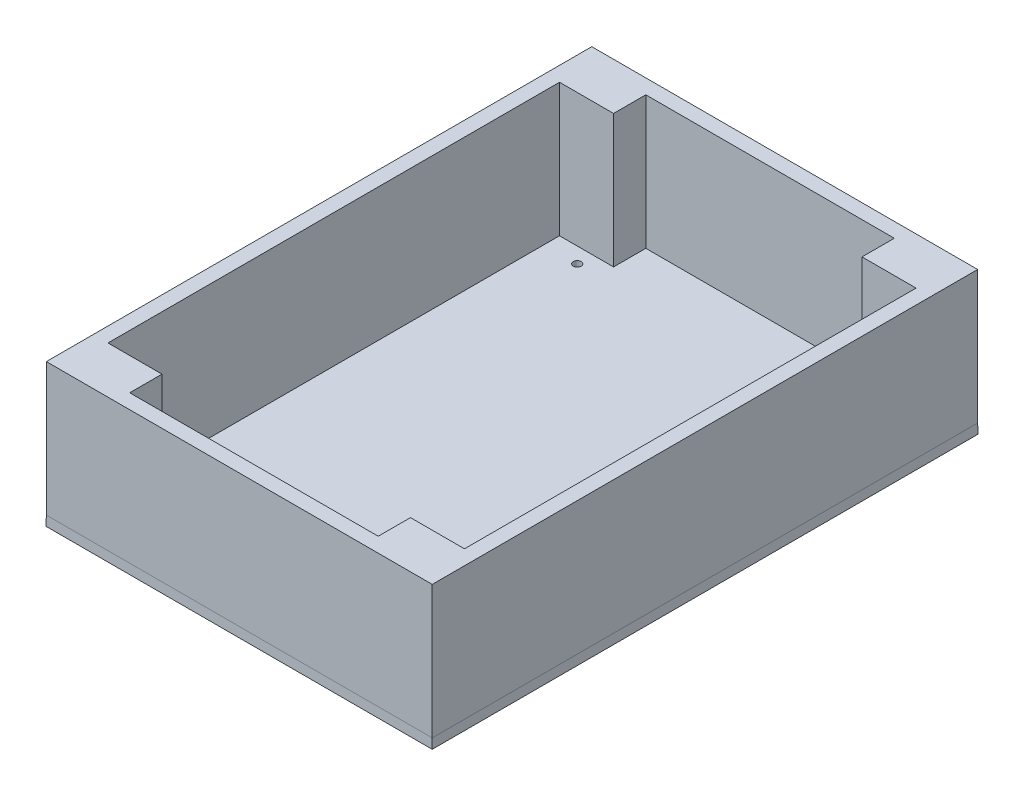
ISO-10303-21;
HEADER;
FILE_DESCRIPTION(('STEP AP214'),'2;1');
FILE_NAME('part.step','',(''),(''),'','','');
FILE_SCHEMA(('AUTOMOTIVE_DESIGN { 1 0 10303 214 1 1 1 1 }'));
ENDSEC;
DATA;
#1=APPLICATION_CONTEXT('core data for automotive mechanical design processes');
#2=APPLICATION_PROTOCOL_DEFINITION('international standard','automotive_design',2000,#1);
#3=PRODUCT_CONTEXT('',#1,'mechanical');
#4=PRODUCT('Part','Part','',(#3));
#5=PRODUCT_RELATED_PRODUCT_CATEGORY('part','',(#4));
#6=PRODUCT_DEFINITION_FORMATION('','',#4);
#7=PRODUCT_DEFINITION_CONTEXT('part definition',#1,'design');
#8=PRODUCT_DEFINITION('design','',#6,#7);
#9=PRODUCT_DEFINITION_SHAPE('','',#8);
#10=(LENGTH_UNIT() NAMED_UNIT(*) SI_UNIT(.MILLI.,.METRE.));
#11=(NAMED_UNIT(*) PLANE_ANGLE_UNIT() SI_UNIT($,.RADIAN.));
#12=(NAMED_UNIT(*) SI_UNIT($,.STERADIAN.) SOLID_ANGLE_UNIT());
#13=UNCERTAINTY_MEASURE_WITH_UNIT(LENGTH_MEASURE(1.E-05),#10,'distance_accuracy_value','');
#14=(GEOMETRIC_REPRESENTATION_CONTEXT(3) GLOBAL_UNCERTAINTY_ASSIGNED_CONTEXT((#13)) GLOBAL_UNIT_ASSIGNED_CONTEXT((#10,
#11,#12)) REPRESENTATION_CONTEXT('',''));
#15=CARTESIAN_POINT('',(0.,0.,0.));
#16=DIRECTION('',(0.,0.,1.));
#17=DIRECTION('',(1.,0.,0.));
#18=AXIS2_PLACEMENT_3D('',#15,#16,#17);
#19=CARTESIAN_POINT('',(-60.5028,0.,85.4964));
#20=DIRECTION('',(-0.999847695156391,0.0174524064372835,0.));
#21=DIRECTION('',(-0.0174524064372836,-0.999847695156391,0.));
#22=AXIS2_PLACEMENT_3D('',#19,#20,#21);
#23=PLANE('',#22);
#24=DIRECTION('',(0.,0.,1.));
#25=VECTOR('',#24,1.);
#26=CARTESIAN_POINT('',(-60.5028,0.,85.4964));
#27=LINE('',#26,#25);
#28=CARTESIAN_POINT('',(-60.5028,0.,-85.4964));
#29=VERTEX_POINT('',#28);
#30=CARTESIAN_POINT('',(-60.5028,0.,85.4964));
#31=VERTEX_POINT('',#30);
#32=EDGE_CURVE('E277',#29,#31,#27,.T.);
#33=ORIENTED_EDGE('',*,*,#32,.T.);
#34=DIRECTION('',(-0.0174497491606827,-0.999695459881887,0.0174497491606827));
#35=VECTOR('',#34,1.);
#36=CARTESIAN_POINT('',(-60.4659545515968,2.11087432528956,85.4595545515967));
#37=LINE('',#36,#35);
#38=CARTESIAN_POINT('',(-60.4495969620988,3.048,85.4431969620988));
#39=VERTEX_POINT('',#38);
#40=EDGE_CURVE('E11',#39,#31,#37,.T.);
#41=ORIENTED_EDGE('',*,*,#40,.F.);
#42=DIRECTION('',(0.,0.,-1.));
#43=VECTOR('',#42,1.);
#44=CARTESIAN_POINT('',(-60.4495969620988,3.048,85.4964));
#45=LINE('',#44,#43);
#46=CARTESIAN_POINT('',(-60.4495969620988,3.048,-85.4431969620988));
#47=VERTEX_POINT('',#46);
#48=EDGE_CURVE('E285',#47,#39,#45,.F.);
#49=ORIENTED_EDGE('',*,*,#48,.F.);
#50=DIRECTION('',(-0.0174497491606827,-0.999695459881887,-0.0174497491606827));
#51=VECTOR('',#50,1.);
#52=CARTESIAN_POINT('',(-60.4507337618282,2.98287278712202,-85.4443337618282));
#53=LINE('',#52,#51);
#54=EDGE_CURVE('E287',#47,#29,#53,.T.);
#55=ORIENTED_EDGE('',*,*,#54,.T.);
#56=EDGE_LOOP('',(#33,#41,#49,#55));
#57=FACE_BOUND('',#56,.T.);
#58=ADVANCED_FACE('F35',(#57),#23,.T.);
#59=CARTESIAN_POINT('',(60.5028,0.,85.4964));
#60=DIRECTION('',(0.,0.0174524064372835,0.999847695156391));
#61=DIRECTION('',(0.,-0.999847695156391,0.0174524064372836));
#62=AXIS2_PLACEMENT_3D('',#59,#60,#61);
#63=PLANE('',#62);
#64=DIRECTION('',(1.,0.,0.));
#65=VECTOR('',#64,1.);
#66=CARTESIAN_POINT('',(60.5028,0.,85.4964));
#67=LINE('',#66,#65);
#68=CARTESIAN_POINT('',(60.5028,0.,85.4964));
#69=VERTEX_POINT('',#68);
#70=EDGE_CURVE('E280',#31,#69,#67,.T.);
#71=ORIENTED_EDGE('',*,*,#70,.T.);
#72=DIRECTION('',(0.0174497491606827,-0.999695459881887,0.0174497491606827));
#73=VECTOR('',#72,1.);
#74=CARTESIAN_POINT('',(60.5028,0.,85.4964));
#75=LINE('',#74,#73);
#76=CARTESIAN_POINT('',(60.4495969620988,3.048,85.4431969620988));
#77=VERTEX_POINT('',#76);
#78=EDGE_CURVE('E44',#77,#69,#75,.T.);
#79=ORIENTED_EDGE('',*,*,#78,.F.);
#80=DIRECTION('',(-1.,0.,0.));
#81=VECTOR('',#80,1.);
#82=CARTESIAN_POINT('',(60.5028,3.048,85.4431969620988));
#83=LINE('',#82,#81);
#84=EDGE_CURVE('E297',#39,#77,#83,.F.);
#85=ORIENTED_EDGE('',*,*,#84,.F.);
#86=ORIENTED_EDGE('',*,*,#40,.T.);
#87=EDGE_LOOP('',(#71,#79,#85,#86));
#88=FACE_BOUND('',#87,.T.);
#89=ADVANCED_FACE('F37',(#88),#63,.T.);
#90=CARTESIAN_POINT('',(60.5028,0.,85.4964));
#91=DIRECTION('',(0.999847695156391,0.0174524064372835,0.));
#92=DIRECTION('',(-0.0174524064372836,0.999847695156391,0.));
#93=AXIS2_PLACEMENT_3D('',#90,#91,#92);
#94=PLANE('',#93);
#95=DIRECTION('',(0.,0.,-1.));
#96=VECTOR('',#95,1.);
#97=CARTESIAN_POINT('',(60.5028,0.,85.4964));
#98=LINE('',#97,#96);
#99=CARTESIAN_POINT('',(60.5028,0.,-85.4964));
#100=VERTEX_POINT('',#99);
#101=EDGE_CURVE('E282',#69,#100,#98,.T.);
#102=ORIENTED_EDGE('',*,*,#101,.T.);
#103=DIRECTION('',(0.0174497491606827,-0.999695459881887,-0.0174497491606827));
#104=VECTOR('',#103,1.);
#105=CARTESIAN_POINT('',(60.5028,0.,-85.4964));
#106=LINE('',#105,#104);
#107=CARTESIAN_POINT('',(60.4495969620988,3.048,-85.4431969620988));
#108=VERTEX_POINT('',#107);
#109=EDGE_CURVE('E290',#108,#100,#106,.T.);
#110=ORIENTED_EDGE('',*,*,#109,.F.);
#111=DIRECTION('',(0.,0.,1.));
#112=VECTOR('',#111,1.);
#113=CARTESIAN_POINT('',(60.4495969620988,3.048,85.4964));
#114=LINE('',#113,#112);
#115=EDGE_CURVE('E299',#77,#108,#114,.F.);
#116=ORIENTED_EDGE('',*,*,#115,.F.);
#117=ORIENTED_EDGE('',*,*,#78,.T.);
#118=EDGE_LOOP('',(#102,#110,#116,#117));
#119=FACE_BOUND('',#118,.T.);
#120=ADVANCED_FACE('F315',(#119),#94,.T.);
#121=CARTESIAN_POINT('',(60.5028,0.,-85.4964));
#122=DIRECTION('',(0.,0.0174524064372835,-0.999847695156391));
#123=DIRECTION('',(0.,0.999847695156391,0.0174524064372836));
#124=AXIS2_PLACEMENT_3D('',#121,#122,#123);
#125=PLANE('',#124);
#126=DIRECTION('',(-1.,0.,0.));
#127=VECTOR('',#126,1.);
#128=CARTESIAN_POINT('',(60.5028,0.,-85.4964));
#129=LINE('',#128,#127);
#130=EDGE_CURVE('E284',#100,#29,#129,.T.);
#131=ORIENTED_EDGE('',*,*,#130,.T.);
#132=ORIENTED_EDGE('',*,*,#54,.F.);
#133=DIRECTION('',(1.,0.,0.));
#134=VECTOR('',#133,1.);
#135=CARTESIAN_POINT('',(60.5028,3.048,-85.4431969620988));
#136=LINE('',#135,#134);
#137=EDGE_CURVE('E39',#108,#47,#136,.F.);
#138=ORIENTED_EDGE('',*,*,#137,.F.);
#139=ORIENTED_EDGE('',*,*,#109,.T.);
#140=EDGE_LOOP('',(#131,#132,#138,#139));
#141=FACE_BOUND('',#140,.T.);
#142=ADVANCED_FACE('F311',(#141),#125,.T.);
#143=CARTESIAN_POINT('',(0.,0.,0.));
#144=DIRECTION('',(0.,1.,0.));
#145=DIRECTION('',(0.,0.,1.));
#146=AXIS2_PLACEMENT_3D('',#143,#144,#145);
#147=PLANE('',#146);
#148=CARTESIAN_POINT('',(-45.466,0.,-65.8876));
#149=DIRECTION('',(0.,1.,0.));
#150=DIRECTION('',(0.,0.,1.));
#151=AXIS2_PLACEMENT_3D('',#148,#149,#150);
#152=CIRCLE('',#151,1.24999999999999);
#153=CARTESIAN_POINT('',(-45.466,0.,-64.6376));
#154=VERTEX_POINT('',#153);
#155=EDGE_CURVE('E574',#154,#154,#152,.T.);
#156=ORIENTED_EDGE('',*,*,#155,.T.);
#157=EDGE_LOOP('',(#156));
#158=FACE_BOUND('',#157,.T.);
#159=CARTESIAN_POINT('',(45.466,0.,65.8876));
#160=DIRECTION('',(0.,1.,0.));
#161=DIRECTION('',(0.,0.,1.));
#162=AXIS2_PLACEMENT_3D('',#159,#160,#161);
#163=CIRCLE('',#162,1.24999999999999);
#164=CARTESIAN_POINT('',(45.466,0.,67.1376));
#165=VERTEX_POINT('',#164);
#166=EDGE_CURVE('E578',#165,#165,#163,.T.);
#167=ORIENTED_EDGE('',*,*,#166,.T.);
#168=EDGE_LOOP('',(#167));
#169=FACE_BOUND('',#168,.T.);
#170=CARTESIAN_POINT('',(45.466,0.,-65.8876));
#171=DIRECTION('',(0.,1.,0.));
#172=DIRECTION('',(0.,0.,1.));
#173=AXIS2_PLACEMENT_3D('',#170,#171,#172);
#174=CIRCLE('',#173,1.24999999999999);
#175=CARTESIAN_POINT('',(45.466,0.,-64.6376));
#176=VERTEX_POINT('',#175);
#177=EDGE_CURVE('E587',#176,#176,#174,.T.);
#178=ORIENTED_EDGE('',*,*,#177,.T.);
#179=EDGE_LOOP('',(#178));
#180=FACE_BOUND('',#179,.T.);
#181=CARTESIAN_POINT('',(-45.466,0.,65.8876));
#182=DIRECTION('',(0.,1.,0.));
#183=DIRECTION('',(0.,0.,1.));
#184=AXIS2_PLACEMENT_3D('',#181,#182,#183);
#185=CIRCLE('',#184,1.24999999999999);
#186=CARTESIAN_POINT('',(-45.466,0.,67.1376));
#187=VERTEX_POINT('',#186);
#188=EDGE_CURVE('E207',#187,#187,#185,.T.);
#189=ORIENTED_EDGE('',*,*,#188,.T.);
#190=EDGE_LOOP('',(#189));
#191=FACE_BOUND('',#190,.T.);
#192=ORIENTED_EDGE('',*,*,#32,.F.);
#193=ORIENTED_EDGE('',*,*,#130,.F.);
#194=ORIENTED_EDGE('',*,*,#101,.F.);
#195=ORIENTED_EDGE('',*,*,#70,.F.);
#196=EDGE_LOOP('',(#192,#193,#194,#195));
#197=FACE_BOUND('',#196,.T.);
#198=ADVANCED_FACE('F319',(#158,#169,#180,#191,#197),#147,.F.);
#199=CARTESIAN_POINT('',(0.,44.704,0.));
#200=DIRECTION('',(0.,1.,0.));
#201=DIRECTION('',(0.,0.,1.));
#202=AXIS2_PLACEMENT_3D('',#199,#200,#201);
#203=PLANE('',#202);
#204=DIRECTION('',(-1.,0.,0.));
#205=VECTOR('',#204,1.);
#206=CARTESIAN_POINT('',(60.4495969620988,44.704,-85.4431969620988));
#207=LINE('',#206,#205);
#208=CARTESIAN_POINT('',(60.4495969620988,44.704,-85.4431969620988));
#209=VERTEX_POINT('',#208);
#210=CARTESIAN_POINT('',(-60.4495969620988,44.704,-85.4431969620988));
#211=VERTEX_POINT('',#210);
#212=EDGE_CURVE('E176',#209,#211,#207,.T.);
#213=ORIENTED_EDGE('',*,*,#212,.T.);
#214=DIRECTION('',(0.,0.,1.));
#215=VECTOR('',#214,1.);
#216=CARTESIAN_POINT('',(-60.4495969620988,44.704,-85.4431969620988));
#217=LINE('',#216,#215);
#218=CARTESIAN_POINT('',(-60.4495969620988,44.704,85.4431969620988));
#219=VERTEX_POINT('',#218);
#220=EDGE_CURVE('E259',#211,#219,#217,.T.);
#221=ORIENTED_EDGE('',*,*,#220,.T.);
#222=DIRECTION('',(1.,0.,0.));
#223=VECTOR('',#222,1.);
#224=CARTESIAN_POINT('',(-60.4495969620988,44.704,85.4431969620988));
#225=LINE('',#224,#223);
#226=CARTESIAN_POINT('',(60.4495969620988,44.704,85.4431969620988));
#227=VERTEX_POINT('',#226);
#228=EDGE_CURVE('E261',#219,#227,#225,.T.);
#229=ORIENTED_EDGE('',*,*,#228,.T.);
#230=DIRECTION('',(0.,0.,-1.));
#231=VECTOR('',#230,1.);
#232=CARTESIAN_POINT('',(60.4495969620988,44.704,85.4431969620988));
#233=LINE('',#232,#231);
#234=EDGE_CURVE('E263',#227,#209,#233,.T.);
#235=ORIENTED_EDGE('',*,*,#234,.T.);
#236=EDGE_LOOP('',(#213,#221,#229,#235));
#237=FACE_BOUND('',#236,.T.);
#238=DIRECTION('',(-1.,0.,0.));
#239=VECTOR('',#238,1.);
#240=CARTESIAN_POINT('',(38.9255,44.704,-80.8457969620988));
#241=LINE('',#240,#239);
#242=CARTESIAN_POINT('',(38.9255,44.704,-80.8457969620988));
#243=VERTEX_POINT('',#242);
#244=CARTESIAN_POINT('',(-38.9255,44.704,-80.8457969620988));
#245=VERTEX_POINT('',#244);
#246=EDGE_CURVE('E170',#243,#245,#241,.T.);
#247=ORIENTED_EDGE('',*,*,#246,.F.);
#248=DIRECTION('',(0.,0.,-1.));
#249=VECTOR('',#248,1.);
#250=CARTESIAN_POINT('',(38.9255,44.704,-80.8457969620988));
#251=LINE('',#250,#249);
#252=CARTESIAN_POINT('',(38.9255,44.704,-70.739));
#253=VERTEX_POINT('',#252);
#254=EDGE_CURVE('E161',#253,#243,#251,.T.);
#255=ORIENTED_EDGE('',*,*,#254,.F.);
#256=DIRECTION('',(-1.,0.,0.));
#257=VECTOR('',#256,1.);
#258=CARTESIAN_POINT('',(38.9255,44.704,-70.739));
#259=LINE('',#258,#257);
#260=CARTESIAN_POINT('',(55.8521969620988,44.704,-70.739));
#261=VERTEX_POINT('',#260);
#262=EDGE_CURVE('E204',#261,#253,#259,.T.);
#263=ORIENTED_EDGE('',*,*,#262,.F.);
#264=DIRECTION('',(0.,0.,-1.));
#265=VECTOR('',#264,1.);
#266=CARTESIAN_POINT('',(55.8521969620988,44.704,70.7389999999999));
#267=LINE('',#266,#265);
#268=CARTESIAN_POINT('',(55.8521969620988,44.704,70.7389999999999));
#269=VERTEX_POINT('',#268);
#270=EDGE_CURVE('E201',#269,#261,#267,.T.);
#271=ORIENTED_EDGE('',*,*,#270,.F.);
#272=DIRECTION('',(1.,0.,0.));
#273=VECTOR('',#272,1.);
#274=CARTESIAN_POINT('',(38.9255,44.704,70.7389999999999));
#275=LINE('',#274,#273);
#276=CARTESIAN_POINT('',(38.9255,44.704,70.7389999999999));
#277=VERTEX_POINT('',#276);
#278=EDGE_CURVE('E199',#277,#269,#275,.T.);
#279=ORIENTED_EDGE('',*,*,#278,.F.);
#280=DIRECTION('',(0.,0.,-1.));
#281=VECTOR('',#280,1.);
#282=CARTESIAN_POINT('',(38.9255,44.704,80.8457969620987));
#283=LINE('',#282,#281);
#284=CARTESIAN_POINT('',(38.9255,44.704,80.8457969620987));
#285=VERTEX_POINT('',#284);
#286=EDGE_CURVE('E197',#285,#277,#283,.T.);
#287=ORIENTED_EDGE('',*,*,#286,.F.);
#288=DIRECTION('',(1.,0.,0.));
#289=VECTOR('',#288,1.);
#290=CARTESIAN_POINT('',(-38.9255,44.704,80.8457969620987));
#291=LINE('',#290,#289);
#292=CARTESIAN_POINT('',(-38.9255,44.704,80.8457969620987));
#293=VERTEX_POINT('',#292);
#294=EDGE_CURVE('E195',#293,#285,#291,.T.);
#295=ORIENTED_EDGE('',*,*,#294,.F.);
#296=DIRECTION('',(0.,0.,1.));
#297=VECTOR('',#296,1.);
#298=CARTESIAN_POINT('',(-38.9255,44.704,80.8457969620987));
#299=LINE('',#298,#297);
#300=CARTESIAN_POINT('',(-38.9255,44.704,70.7389999999999));
#301=VERTEX_POINT('',#300);
#302=EDGE_CURVE('E193',#301,#293,#299,.T.);
#303=ORIENTED_EDGE('',*,*,#302,.F.);
#304=DIRECTION('',(1.,0.,0.));
#305=VECTOR('',#304,1.);
#306=CARTESIAN_POINT('',(-38.9255,44.704,70.7389999999999));
#307=LINE('',#306,#305);
#308=CARTESIAN_POINT('',(-55.8521969620988,44.704,70.739));
#309=VERTEX_POINT('',#308);
#310=EDGE_CURVE('E191',#309,#301,#307,.T.);
#311=ORIENTED_EDGE('',*,*,#310,.F.);
#312=DIRECTION('',(0.,0.,1.));
#313=VECTOR('',#312,1.);
#314=CARTESIAN_POINT('',(-55.8521969620988,44.704,-70.739));
#315=LINE('',#314,#313);
#316=CARTESIAN_POINT('',(-55.8521969620988,44.704,-70.739));
#317=VERTEX_POINT('',#316);
#318=EDGE_CURVE('E189',#317,#309,#315,.T.);
#319=ORIENTED_EDGE('',*,*,#318,.F.);
#320=DIRECTION('',(-1.,0.,0.));
#321=VECTOR('',#320,1.);
#322=CARTESIAN_POINT('',(-38.9255,44.704,-70.739));
#323=LINE('',#322,#321);
#324=CARTESIAN_POINT('',(-38.9255,44.704,-70.739));
#325=VERTEX_POINT('',#324);
#326=EDGE_CURVE('E184',#325,#317,#323,.T.);
#327=ORIENTED_EDGE('',*,*,#326,.F.);
#328=DIRECTION('',(0.,0.,1.));
#329=VECTOR('',#328,1.);
#330=CARTESIAN_POINT('',(-38.9255,44.704,-80.8457969620988));
#331=LINE('',#330,#329);
#332=EDGE_CURVE('E182',#245,#325,#331,.T.);
#333=ORIENTED_EDGE('',*,*,#332,.F.);
#334=EDGE_LOOP('',(#247,#255,#263,#271,#279,#287,#295,#303,#311,#319,#327,#333));
#335=FACE_BOUND('',#334,.T.);
#336=ADVANCED_FACE('F180',(#237,#335),#203,.T.);
#337=CARTESIAN_POINT('',(60.4495969620988,44.704,-85.4431969620988));
#338=DIRECTION('',(0.,0.,1.));
#339=DIRECTION('',(1.,0.,0.));
#340=AXIS2_PLACEMENT_3D('',#337,#338,#339);
#341=PLANE('',#340);
#342=ORIENTED_EDGE('',*,*,#137,.T.);
#343=DIRECTION('',(0.,-1.,0.));
#344=VECTOR('',#343,1.);
#345=CARTESIAN_POINT('',(-60.4495969620988,44.704,-85.4431969620988));
#346=LINE('',#345,#344);
#347=EDGE_CURVE('E274',#211,#47,#346,.T.);
#348=ORIENTED_EDGE('',*,*,#347,.F.);
#349=ORIENTED_EDGE('',*,*,#212,.F.);
#350=DIRECTION('',(0.,-1.,0.));
#351=VECTOR('',#350,1.);
#352=CARTESIAN_POINT('',(60.4495969620988,44.704,-85.4431969620988));
#353=LINE('',#352,#351);
#354=EDGE_CURVE('E265',#209,#108,#353,.T.);
#355=ORIENTED_EDGE('',*,*,#354,.T.);
#356=EDGE_LOOP('',(#342,#348,#349,#355));
#357=FACE_BOUND('',#356,.T.);
#358=ADVANCED_FACE('F307',(#357),#341,.F.);
#359=CARTESIAN_POINT('',(-60.4495969620988,44.704,-85.4431969620988));
#360=DIRECTION('',(1.,0.,0.));
#361=DIRECTION('',(0.,0.,-1.));
#362=AXIS2_PLACEMENT_3D('',#359,#360,#361);
#363=PLANE('',#362);
#364=ORIENTED_EDGE('',*,*,#48,.T.);
#365=DIRECTION('',(0.,-1.,0.));
#366=VECTOR('',#365,1.);
#367=CARTESIAN_POINT('',(-60.4495969620988,44.704,85.4431969620988));
#368=LINE('',#367,#366);
#369=EDGE_CURVE('E271',#219,#39,#368,.T.);
#370=ORIENTED_EDGE('',*,*,#369,.F.);
#371=ORIENTED_EDGE('',*,*,#220,.F.);
#372=ORIENTED_EDGE('',*,*,#347,.T.);
#373=EDGE_LOOP('',(#364,#370,#371,#372));
#374=FACE_BOUND('',#373,.T.);
#375=ADVANCED_FACE('F324',(#374),#363,.F.);
#376=CARTESIAN_POINT('',(-60.4495969620988,44.704,85.4431969620988));
#377=DIRECTION('',(0.,0.,-1.));
#378=DIRECTION('',(-1.,0.,0.));
#379=AXIS2_PLACEMENT_3D('',#376,#377,#378);
#380=PLANE('',#379);
#381=ORIENTED_EDGE('',*,*,#84,.T.);
#382=DIRECTION('',(0.,-1.,0.));
#383=VECTOR('',#382,1.);
#384=CARTESIAN_POINT('',(60.4495969620988,44.704,85.4431969620988));
#385=LINE('',#384,#383);
#386=EDGE_CURVE('E268',#227,#77,#385,.T.);
#387=ORIENTED_EDGE('',*,*,#386,.F.);
#388=ORIENTED_EDGE('',*,*,#228,.F.);
#389=ORIENTED_EDGE('',*,*,#369,.T.);
#390=EDGE_LOOP('',(#381,#387,#388,#389));
#391=FACE_BOUND('',#390,.T.);
#392=ADVANCED_FACE('F331',(#391),#380,.F.);
#393=CARTESIAN_POINT('',(60.4495969620988,44.704,85.4431969620988));
#394=DIRECTION('',(-1.,0.,0.));
#395=DIRECTION('',(0.,0.,1.));
#396=AXIS2_PLACEMENT_3D('',#393,#394,#395);
#397=PLANE('',#396);
#398=ORIENTED_EDGE('',*,*,#115,.T.);
#399=ORIENTED_EDGE('',*,*,#354,.F.);
#400=ORIENTED_EDGE('',*,*,#234,.F.);
#401=ORIENTED_EDGE('',*,*,#386,.T.);
#402=EDGE_LOOP('',(#398,#399,#400,#401));
#403=FACE_BOUND('',#402,.T.);
#404=ADVANCED_FACE('F329',(#403),#397,.F.);
#405=CARTESIAN_POINT('',(38.9255,44.704,-80.8457969620988));
#406=DIRECTION('',(-1.,0.,0.));
#407=DIRECTION('',(0.,0.,1.));
#408=AXIS2_PLACEMENT_3D('',#405,#406,#407);
#409=PLANE('',#408);
#410=DIRECTION('',(0.,0.,-1.));
#411=VECTOR('',#410,1.);
#412=CARTESIAN_POINT('',(38.9255,3.048,-80.8457969620988));
#413=LINE('',#412,#411);
#414=CARTESIAN_POINT('',(38.9255,3.048,-70.739));
#415=VERTEX_POINT('',#414);
#416=CARTESIAN_POINT('',(38.9255,3.048,-80.8457969620988));
#417=VERTEX_POINT('',#416);
#418=EDGE_CURVE('E52',#415,#417,#413,.T.);
#419=ORIENTED_EDGE('',*,*,#418,.F.);
#420=DIRECTION('',(0.,-1.,0.));
#421=VECTOR('',#420,1.);
#422=CARTESIAN_POINT('',(38.9255,44.704,-70.739));
#423=LINE('',#422,#421);
#424=EDGE_CURVE('E166',#253,#415,#423,.T.);
#425=ORIENTED_EDGE('',*,*,#424,.F.);
#426=ORIENTED_EDGE('',*,*,#254,.T.);
#427=DIRECTION('',(0.,-1.,0.));
#428=VECTOR('',#427,1.);
#429=CARTESIAN_POINT('',(38.9255,44.704,-80.8457969620988));
#430=LINE('',#429,#428);
#431=EDGE_CURVE('E164',#243,#417,#430,.T.);
#432=ORIENTED_EDGE('',*,*,#431,.T.);
#433=EDGE_LOOP('',(#419,#425,#426,#432));
#434=FACE_BOUND('',#433,.T.);
#435=ADVANCED_FACE('F163',(#434),#409,.T.);
#436=CARTESIAN_POINT('',(38.9255,44.704,-80.8457969620988));
#437=DIRECTION('',(0.,0.,1.));
#438=DIRECTION('',(1.,0.,0.));
#439=AXIS2_PLACEMENT_3D('',#436,#437,#438);
#440=PLANE('',#439);
#441=DIRECTION('',(-1.,0.,0.));
#442=VECTOR('',#441,1.);
#443=CARTESIAN_POINT('',(38.9255,3.048,-80.8457969620988));
#444=LINE('',#443,#442);
#445=CARTESIAN_POINT('',(-38.9255,3.048,-80.8457969620988));
#446=VERTEX_POINT('',#445);
#447=EDGE_CURVE('E56',#417,#446,#444,.T.);
#448=ORIENTED_EDGE('',*,*,#447,.F.);
#449=ORIENTED_EDGE('',*,*,#431,.F.);
#450=ORIENTED_EDGE('',*,*,#246,.T.);
#451=DIRECTION('',(0.,-1.,0.));
#452=VECTOR('',#451,1.);
#453=CARTESIAN_POINT('',(-38.9255,44.704,-80.8457969620988));
#454=LINE('',#453,#452);
#455=EDGE_CURVE('E177',#245,#446,#454,.T.);
#456=ORIENTED_EDGE('',*,*,#455,.T.);
#457=EDGE_LOOP('',(#448,#449,#450,#456));
#458=FACE_BOUND('',#457,.T.);
#459=ADVANCED_FACE('F174',(#458),#440,.T.);
#460=CARTESIAN_POINT('',(-38.9255,44.704,-80.8457969620988));
#461=DIRECTION('',(1.,0.,0.));
#462=DIRECTION('',(0.,0.,-1.));
#463=AXIS2_PLACEMENT_3D('',#460,#461,#462);
#464=PLANE('',#463);
#465=DIRECTION('',(0.,0.,1.));
#466=VECTOR('',#465,1.);
#467=CARTESIAN_POINT('',(-38.9255,3.048,-80.8457969620988));
#468=LINE('',#467,#466);
#469=CARTESIAN_POINT('',(-38.9255,3.048,-70.739));
#470=VERTEX_POINT('',#469);
#471=EDGE_CURVE('E209',#446,#470,#468,.T.);
#472=ORIENTED_EDGE('',*,*,#471,.F.);
#473=ORIENTED_EDGE('',*,*,#455,.F.);
#474=ORIENTED_EDGE('',*,*,#332,.T.);
#475=DIRECTION('',(0.,-1.,0.));
#476=VECTOR('',#475,1.);
#477=CARTESIAN_POINT('',(-38.9255,44.704,-70.739));
#478=LINE('',#477,#476);
#479=EDGE_CURVE('E253',#325,#470,#478,.T.);
#480=ORIENTED_EDGE('',*,*,#479,.T.);
#481=EDGE_LOOP('',(#472,#473,#474,#480));
#482=FACE_BOUND('',#481,.T.);
#483=ADVANCED_FACE('F411',(#482),#464,.T.);
#484=CARTESIAN_POINT('',(-38.9255,44.704,-70.739));
#485=DIRECTION('',(0.,0.,1.));
#486=DIRECTION('',(1.,0.,0.));
#487=AXIS2_PLACEMENT_3D('',#484,#485,#486);
#488=PLANE('',#487);
#489=DIRECTION('',(-1.,0.,0.));
#490=VECTOR('',#489,1.);
#491=CARTESIAN_POINT('',(-38.9255,3.048,-70.739));
#492=LINE('',#491,#490);
#493=CARTESIAN_POINT('',(-55.8521969620988,3.048,-70.739));
#494=VERTEX_POINT('',#493);
#495=EDGE_CURVE('E211',#470,#494,#492,.T.);
#496=ORIENTED_EDGE('',*,*,#495,.F.);
#497=ORIENTED_EDGE('',*,*,#479,.F.);
#498=ORIENTED_EDGE('',*,*,#326,.T.);
#499=DIRECTION('',(0.,-1.,0.));
#500=VECTOR('',#499,1.);
#501=CARTESIAN_POINT('',(-55.8521969620988,44.704,-70.739));
#502=LINE('',#501,#500);
#503=EDGE_CURVE('E250',#317,#494,#502,.T.);
#504=ORIENTED_EDGE('',*,*,#503,.T.);
#505=EDGE_LOOP('',(#496,#497,#498,#504));
#506=FACE_BOUND('',#505,.T.);
#507=ADVANCED_FACE('F420',(#506),#488,.T.);
#508=CARTESIAN_POINT('',(-55.8521969620988,44.704,-70.739));
#509=DIRECTION('',(1.,0.,0.));
#510=DIRECTION('',(0.,0.,-1.));
#511=AXIS2_PLACEMENT_3D('',#508,#509,#510);
#512=PLANE('',#511);
#513=DIRECTION('',(0.,0.,1.));
#514=VECTOR('',#513,1.);
#515=CARTESIAN_POINT('',(-55.8521969620988,3.048,-70.739));
#516=LINE('',#515,#514);
#517=CARTESIAN_POINT('',(-55.8521969620988,3.048,70.739));
#518=VERTEX_POINT('',#517);
#519=EDGE_CURVE('E213',#494,#518,#516,.T.);
#520=ORIENTED_EDGE('',*,*,#519,.F.);
#521=ORIENTED_EDGE('',*,*,#503,.F.);
#522=ORIENTED_EDGE('',*,*,#318,.T.);
#523=DIRECTION('',(0.,-1.,0.));
#524=VECTOR('',#523,1.);
#525=CARTESIAN_POINT('',(-55.8521969620988,44.704,70.739));
#526=LINE('',#525,#524);
#527=EDGE_CURVE('E247',#309,#518,#526,.T.);
#528=ORIENTED_EDGE('',*,*,#527,.T.);
#529=EDGE_LOOP('',(#520,#521,#522,#528));
#530=FACE_BOUND('',#529,.T.);
#531=ADVANCED_FACE('F430',(#530),#512,.T.);
#532=CARTESIAN_POINT('',(-38.9255,44.704,70.7389999999999));
#533=DIRECTION('',(0.,0.,-1.));
#534=DIRECTION('',(-1.,0.,0.));
#535=AXIS2_PLACEMENT_3D('',#532,#533,#534);
#536=PLANE('',#535);
#537=DIRECTION('',(1.,0.,0.));
#538=VECTOR('',#537,1.);
#539=CARTESIAN_POINT('',(-38.9255,3.048,70.7389999999999));
#540=LINE('',#539,#538);
#541=CARTESIAN_POINT('',(-38.9255,3.048,70.7389999999999));
#542=VERTEX_POINT('',#541);
#543=EDGE_CURVE('E215',#518,#542,#540,.T.);
#544=ORIENTED_EDGE('',*,*,#543,.F.);
#545=ORIENTED_EDGE('',*,*,#527,.F.);
#546=ORIENTED_EDGE('',*,*,#310,.T.);
#547=DIRECTION('',(0.,-1.,0.));
#548=VECTOR('',#547,1.);
#549=CARTESIAN_POINT('',(-38.9255,44.704,70.7389999999999));
#550=LINE('',#549,#548);
#551=EDGE_CURVE('E244',#301,#542,#550,.T.);
#552=ORIENTED_EDGE('',*,*,#551,.T.);
#553=EDGE_LOOP('',(#544,#545,#546,#552));
#554=FACE_BOUND('',#553,.T.);
#555=ADVANCED_FACE('F440',(#554),#536,.T.);
#556=CARTESIAN_POINT('',(-38.9255,44.704,80.8457969620987));
#557=DIRECTION('',(1.,0.,0.));
#558=DIRECTION('',(0.,0.,-1.));
#559=AXIS2_PLACEMENT_3D('',#556,#557,#558);
#560=PLANE('',#559);
#561=DIRECTION('',(0.,0.,1.));
#562=VECTOR('',#561,1.);
#563=CARTESIAN_POINT('',(-38.9255,3.048,80.8457969620987));
#564=LINE('',#563,#562);
#565=CARTESIAN_POINT('',(-38.9255,3.048,80.8457969620987));
#566=VERTEX_POINT('',#565);
#567=EDGE_CURVE('E217',#542,#566,#564,.T.);
#568=ORIENTED_EDGE('',*,*,#567,.F.);
#569=ORIENTED_EDGE('',*,*,#551,.F.);
#570=ORIENTED_EDGE('',*,*,#302,.T.);
#571=DIRECTION('',(0.,-1.,0.));
#572=VECTOR('',#571,1.);
#573=CARTESIAN_POINT('',(-38.9255,44.704,80.8457969620987));
#574=LINE('',#573,#572);
#575=EDGE_CURVE('E241',#293,#566,#574,.T.);
#576=ORIENTED_EDGE('',*,*,#575,.T.);
#577=EDGE_LOOP('',(#568,#569,#570,#576));
#578=FACE_BOUND('',#577,.T.);
#579=ADVANCED_FACE('F450',(#578),#560,.T.);
#580=CARTESIAN_POINT('',(-38.9255,44.704,80.8457969620987));
#581=DIRECTION('',(0.,0.,-1.));
#582=DIRECTION('',(-1.,0.,0.));
#583=AXIS2_PLACEMENT_3D('',#580,#581,#582);
#584=PLANE('',#583);
#585=DIRECTION('',(1.,0.,0.));
#586=VECTOR('',#585,1.);
#587=CARTESIAN_POINT('',(-38.9255,3.048,80.8457969620987));
#588=LINE('',#587,#586);
#589=CARTESIAN_POINT('',(38.9255,3.048,80.8457969620987));
#590=VERTEX_POINT('',#589);
#591=EDGE_CURVE('E219',#566,#590,#588,.T.);
#592=ORIENTED_EDGE('',*,*,#591,.F.);
#593=ORIENTED_EDGE('',*,*,#575,.F.);
#594=ORIENTED_EDGE('',*,*,#294,.T.);
#595=DIRECTION('',(0.,-1.,0.));
#596=VECTOR('',#595,1.);
#597=CARTESIAN_POINT('',(38.9255,44.704,80.8457969620987));
#598=LINE('',#597,#596);
#599=EDGE_CURVE('E238',#285,#590,#598,.T.);
#600=ORIENTED_EDGE('',*,*,#599,.T.);
#601=EDGE_LOOP('',(#592,#593,#594,#600));
#602=FACE_BOUND('',#601,.T.);
#603=ADVANCED_FACE('F460',(#602),#584,.T.);
#604=CARTESIAN_POINT('',(38.9255,44.704,80.8457969620987));
#605=DIRECTION('',(-1.,0.,0.));
#606=DIRECTION('',(0.,0.,1.));
#607=AXIS2_PLACEMENT_3D('',#604,#605,#606);
#608=PLANE('',#607);
#609=DIRECTION('',(0.,0.,-1.));
#610=VECTOR('',#609,1.);
#611=CARTESIAN_POINT('',(38.9255,3.048,80.8457969620987));
#612=LINE('',#611,#610);
#613=CARTESIAN_POINT('',(38.9255,3.048,70.7389999999999));
#614=VERTEX_POINT('',#613);
#615=EDGE_CURVE('E221',#590,#614,#612,.T.);
#616=ORIENTED_EDGE('',*,*,#615,.F.);
#617=ORIENTED_EDGE('',*,*,#599,.F.);
#618=ORIENTED_EDGE('',*,*,#286,.T.);
#619=DIRECTION('',(0.,-1.,0.));
#620=VECTOR('',#619,1.);
#621=CARTESIAN_POINT('',(38.9255,44.704,70.7389999999999));
#622=LINE('',#621,#620);
#623=EDGE_CURVE('E235',#277,#614,#622,.T.);
#624=ORIENTED_EDGE('',*,*,#623,.T.);
#625=EDGE_LOOP('',(#616,#617,#618,#624));
#626=FACE_BOUND('',#625,.T.);
#627=ADVANCED_FACE('F470',(#626),#608,.T.);
#628=CARTESIAN_POINT('',(38.9255,44.704,70.7389999999999));
#629=DIRECTION('',(0.,0.,-1.));
#630=DIRECTION('',(-1.,0.,0.));
#631=AXIS2_PLACEMENT_3D('',#628,#629,#630);
#632=PLANE('',#631);
#633=DIRECTION('',(1.,0.,0.));
#634=VECTOR('',#633,1.);
#635=CARTESIAN_POINT('',(38.9255,3.048,70.7389999999999));
#636=LINE('',#635,#634);
#637=CARTESIAN_POINT('',(55.8521969620988,3.048,70.7389999999999));
#638=VERTEX_POINT('',#637);
#639=EDGE_CURVE('E223',#614,#638,#636,.T.);
#640=ORIENTED_EDGE('',*,*,#639,.F.);
#641=ORIENTED_EDGE('',*,*,#623,.F.);
#642=ORIENTED_EDGE('',*,*,#278,.T.);
#643=DIRECTION('',(0.,-1.,0.));
#644=VECTOR('',#643,1.);
#645=CARTESIAN_POINT('',(55.8521969620988,44.704,70.7389999999999));
#646=LINE('',#645,#644);
#647=EDGE_CURVE('E232',#269,#638,#646,.T.);
#648=ORIENTED_EDGE('',*,*,#647,.T.);
#649=EDGE_LOOP('',(#640,#641,#642,#648));
#650=FACE_BOUND('',#649,.T.);
#651=ADVANCED_FACE('F480',(#650),#632,.T.);
#652=CARTESIAN_POINT('',(55.8521969620988,44.704,70.7389999999999));
#653=DIRECTION('',(-1.,0.,0.));
#654=DIRECTION('',(0.,0.,1.));
#655=AXIS2_PLACEMENT_3D('',#652,#653,#654);
#656=PLANE('',#655);
#657=DIRECTION('',(0.,0.,-1.));
#658=VECTOR('',#657,1.);
#659=CARTESIAN_POINT('',(55.8521969620988,3.048,70.7389999999999));
#660=LINE('',#659,#658);
#661=CARTESIAN_POINT('',(55.8521969620988,3.048,-70.739));
#662=VERTEX_POINT('',#661);
#663=EDGE_CURVE('E225',#638,#662,#660,.T.);
#664=ORIENTED_EDGE('',*,*,#663,.F.);
#665=ORIENTED_EDGE('',*,*,#647,.F.);
#666=ORIENTED_EDGE('',*,*,#270,.T.);
#667=DIRECTION('',(0.,-1.,0.));
#668=VECTOR('',#667,1.);
#669=CARTESIAN_POINT('',(55.8521969620988,44.704,-70.739));
#670=LINE('',#669,#668);
#671=EDGE_CURVE('E229',#261,#662,#670,.T.);
#672=ORIENTED_EDGE('',*,*,#671,.T.);
#673=EDGE_LOOP('',(#664,#665,#666,#672));
#674=FACE_BOUND('',#673,.T.);
#675=ADVANCED_FACE('F490',(#674),#656,.T.);
#676=CARTESIAN_POINT('',(38.9255,44.704,-70.739));
#677=DIRECTION('',(0.,0.,1.));
#678=DIRECTION('',(1.,0.,0.));
#679=AXIS2_PLACEMENT_3D('',#676,#677,#678);
#680=PLANE('',#679);
#681=DIRECTION('',(-1.,0.,0.));
#682=VECTOR('',#681,1.);
#683=CARTESIAN_POINT('',(38.9255,3.048,-70.739));
#684=LINE('',#683,#682);
#685=EDGE_CURVE('E171',#662,#415,#684,.T.);
#686=ORIENTED_EDGE('',*,*,#685,.F.);
#687=ORIENTED_EDGE('',*,*,#671,.F.);
#688=ORIENTED_EDGE('',*,*,#262,.T.);
#689=ORIENTED_EDGE('',*,*,#424,.T.);
#690=EDGE_LOOP('',(#686,#687,#688,#689));
#691=FACE_BOUND('',#690,.T.);
#692=ADVANCED_FACE('F499',(#691),#680,.T.);
#693=CARTESIAN_POINT('',(0.,3.048,0.));
#694=DIRECTION('',(0.,1.,0.));
#695=DIRECTION('',(0.,0.,1.));
#696=AXIS2_PLACEMENT_3D('',#693,#694,#695);
#697=PLANE('',#696);
#698=CARTESIAN_POINT('',(-45.466,3.048,-65.8876));
#699=DIRECTION('',(0.,1.,0.));
#700=DIRECTION('',(0.,0.,1.));
#701=AXIS2_PLACEMENT_3D('',#698,#699,#700);
#702=CIRCLE('',#701,1.24999999999999);
#703=CARTESIAN_POINT('',(-45.466,3.048,-64.6376));
#704=VERTEX_POINT('',#703);
#705=EDGE_CURVE('E571',#704,#704,#702,.T.);
#706=ORIENTED_EDGE('',*,*,#705,.F.);
#707=EDGE_LOOP('',(#706));
#708=FACE_BOUND('',#707,.T.);
#709=CARTESIAN_POINT('',(45.466,3.048,65.8876));
#710=DIRECTION('',(0.,1.,0.));
#711=DIRECTION('',(0.,0.,1.));
#712=AXIS2_PLACEMENT_3D('',#709,#710,#711);
#713=CIRCLE('',#712,1.24999999999999);
#714=CARTESIAN_POINT('',(45.466,3.048,67.1376));
#715=VERTEX_POINT('',#714);
#716=EDGE_CURVE('E575',#715,#715,#713,.T.);
#717=ORIENTED_EDGE('',*,*,#716,.F.);
#718=EDGE_LOOP('',(#717));
#719=FACE_BOUND('',#718,.T.);
#720=CARTESIAN_POINT('',(45.466,3.048,-65.8876));
#721=DIRECTION('',(0.,1.,0.));
#722=DIRECTION('',(0.,0.,1.));
#723=AXIS2_PLACEMENT_3D('',#720,#721,#722);
#724=CIRCLE('',#723,1.24999999999999);
#725=CARTESIAN_POINT('',(45.466,3.048,-64.6376));
#726=VERTEX_POINT('',#725);
#727=EDGE_CURVE('E584',#726,#726,#724,.T.);
#728=ORIENTED_EDGE('',*,*,#727,.F.);
#729=EDGE_LOOP('',(#728));
#730=FACE_BOUND('',#729,.T.);
#731=CARTESIAN_POINT('',(-45.466,3.048,65.8876));
#732=DIRECTION('',(0.,1.,0.));
#733=DIRECTION('',(0.,0.,1.));
#734=AXIS2_PLACEMENT_3D('',#731,#732,#733);
#735=CIRCLE('',#734,1.24999999999999);
#736=CARTESIAN_POINT('',(-45.466,3.048,67.1376));
#737=VERTEX_POINT('',#736);
#738=EDGE_CURVE('E590',#737,#737,#735,.T.);
#739=ORIENTED_EDGE('',*,*,#738,.F.);
#740=EDGE_LOOP('',(#739));
#741=FACE_BOUND('',#740,.T.);
#742=ORIENTED_EDGE('',*,*,#418,.T.);
#743=ORIENTED_EDGE('',*,*,#447,.T.);
#744=ORIENTED_EDGE('',*,*,#471,.T.);
#745=ORIENTED_EDGE('',*,*,#495,.T.);
#746=ORIENTED_EDGE('',*,*,#519,.T.);
#747=ORIENTED_EDGE('',*,*,#543,.T.);
#748=ORIENTED_EDGE('',*,*,#567,.T.);
#749=ORIENTED_EDGE('',*,*,#591,.T.);
#750=ORIENTED_EDGE('',*,*,#615,.T.);
#751=ORIENTED_EDGE('',*,*,#639,.T.);
#752=ORIENTED_EDGE('',*,*,#663,.T.);
#753=ORIENTED_EDGE('',*,*,#685,.T.);
#754=EDGE_LOOP('',(#742,#743,#744,#745,#746,#747,#748,#749,#750,#751,#752,#753));
#755=FACE_BOUND('',#754,.T.);
#756=ADVANCED_FACE('F508',(#708,#719,#730,#741,#755),#697,.T.);
#757=CARTESIAN_POINT('',(-45.466,3.048,65.8876));
#758=DIRECTION('',(0.,1.,0.));
#759=DIRECTION('',(0.,0.,1.));
#760=AXIS2_PLACEMENT_3D('',#757,#758,#759);
#761=CYLINDRICAL_SURFACE('',#760,1.24999999999999);
#762=ORIENTED_EDGE('',*,*,#738,.T.);
#763=EDGE_LOOP('',(#762));
#764=FACE_BOUND('',#763,.T.);
#765=ORIENTED_EDGE('',*,*,#188,.F.);
#766=EDGE_LOOP('',(#765));
#767=FACE_BOUND('',#766,.T.);
#768=ADVANCED_FACE('F518',(#764,#767),#761,.F.);
#769=CARTESIAN_POINT('',(45.466,3.048,-65.8876));
#770=DIRECTION('',(0.,1.,0.));
#771=DIRECTION('',(0.,0.,1.));
#772=AXIS2_PLACEMENT_3D('',#769,#770,#771);
#773=CYLINDRICAL_SURFACE('',#772,1.24999999999999);
#774=ORIENTED_EDGE('',*,*,#727,.T.);
#775=EDGE_LOOP('',(#774));
#776=FACE_BOUND('',#775,.T.);
#777=ORIENTED_EDGE('',*,*,#177,.F.);
#778=EDGE_LOOP('',(#777));
#779=FACE_BOUND('',#778,.T.);
#780=ADVANCED_FACE('F527',(#776,#779),#773,.F.);
#781=CARTESIAN_POINT('',(45.466,3.048,65.8876));
#782=DIRECTION('',(0.,1.,0.));
#783=DIRECTION('',(0.,0.,1.));
#784=AXIS2_PLACEMENT_3D('',#781,#782,#783);
#785=CYLINDRICAL_SURFACE('',#784,1.24999999999999);
#786=ORIENTED_EDGE('',*,*,#716,.T.);
#787=EDGE_LOOP('',(#786));
#788=FACE_BOUND('',#787,.T.);
#789=ORIENTED_EDGE('',*,*,#166,.F.);
#790=EDGE_LOOP('',(#789));
#791=FACE_BOUND('',#790,.T.);
#792=ADVANCED_FACE('F534',(#788,#791),#785,.F.);
#793=CARTESIAN_POINT('',(-45.466,3.048,-65.8876));
#794=DIRECTION('',(0.,1.,0.));
#795=DIRECTION('',(0.,0.,1.));
#796=AXIS2_PLACEMENT_3D('',#793,#794,#795);
#797=CYLINDRICAL_SURFACE('',#796,1.24999999999999);
#798=ORIENTED_EDGE('',*,*,#705,.T.);
#799=EDGE_LOOP('',(#798));
#800=FACE_BOUND('',#799,.T.);
#801=ORIENTED_EDGE('',*,*,#155,.F.);
#802=EDGE_LOOP('',(#801));
#803=FACE_BOUND('',#802,.T.);
#804=ADVANCED_FACE('F542',(#800,#803),#797,.F.);
#805=CLOSED_SHELL('',(#58,#89,#120,#142,#198,#336,#358,#375,#392,#404,#435,#459,#483,#507,#531,
#555,#579,#603,#627,#651,#675,#692,#756,#768,#780,#792,#804));
#806=MANIFOLD_SOLID_BREP('B2',#805);
#807=ADVANCED_BREP_SHAPE_REPRESENTATION('',(#18,#806),#14);
#808=SHAPE_DEFINITION_REPRESENTATION(#9,#807);
ENDSEC;
END-ISO-10303-21;
